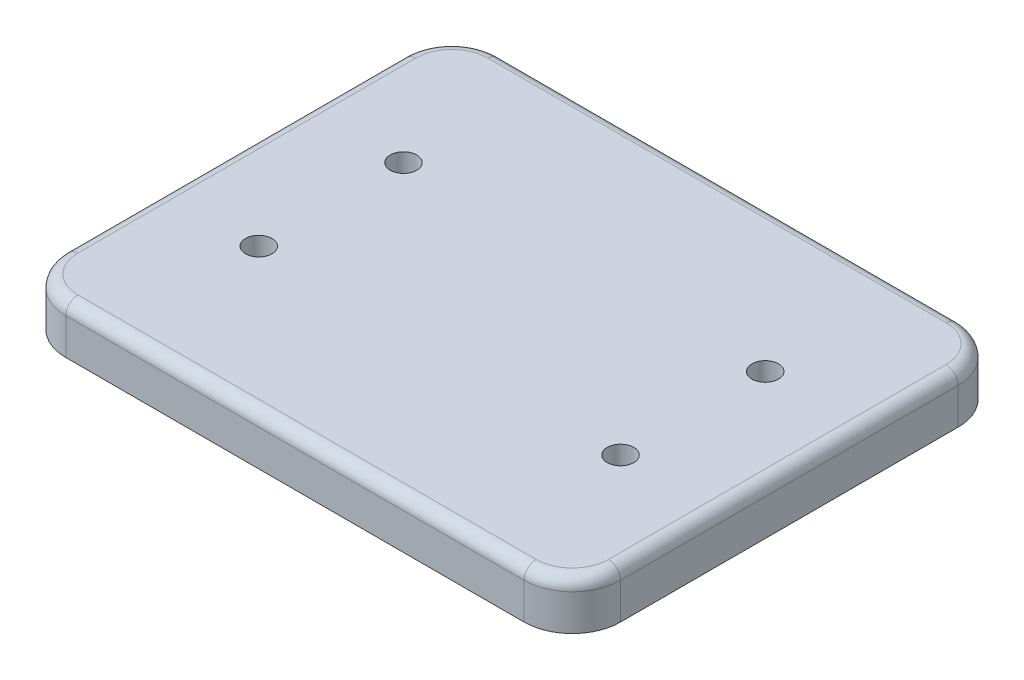
ISO-10303-21;
HEADER;
FILE_DESCRIPTION(('STEP AP214'),'2;1');
FILE_NAME('part.step','',(''),(''),'','','');
FILE_SCHEMA(('AUTOMOTIVE_DESIGN { 1 0 10303 214 1 1 1 1 }'));
ENDSEC;
DATA;
#1=APPLICATION_CONTEXT('core data for automotive mechanical design processes');
#2=APPLICATION_PROTOCOL_DEFINITION('international standard','automotive_design',2000,#1);
#3=PRODUCT_CONTEXT('',#1,'mechanical');
#4=PRODUCT('Part','Part','',(#3));
#5=PRODUCT_RELATED_PRODUCT_CATEGORY('part','',(#4));
#6=PRODUCT_DEFINITION_FORMATION('','',#4);
#7=PRODUCT_DEFINITION_CONTEXT('part definition',#1,'design');
#8=PRODUCT_DEFINITION('design','',#6,#7);
#9=PRODUCT_DEFINITION_SHAPE('','',#8);
#10=(LENGTH_UNIT() NAMED_UNIT(*) SI_UNIT(.MILLI.,.METRE.));
#11=(NAMED_UNIT(*) PLANE_ANGLE_UNIT() SI_UNIT($,.RADIAN.));
#12=(NAMED_UNIT(*) SI_UNIT($,.STERADIAN.) SOLID_ANGLE_UNIT());
#13=UNCERTAINTY_MEASURE_WITH_UNIT(LENGTH_MEASURE(1.E-05),#10,'distance_accuracy_value','');
#14=(GEOMETRIC_REPRESENTATION_CONTEXT(3) GLOBAL_UNCERTAINTY_ASSIGNED_CONTEXT((#13)) GLOBAL_UNIT_ASSIGNED_CONTEXT((#10,
#11,#12)) REPRESENTATION_CONTEXT('',''));
#15=CARTESIAN_POINT('',(0.,0.,0.));
#16=DIRECTION('',(0.,0.,1.));
#17=DIRECTION('',(1.,0.,0.));
#18=AXIS2_PLACEMENT_3D('',#15,#16,#17);
#19=CARTESIAN_POINT('',(-75.,-20.,30.));
#20=DIRECTION('',(0.,1.,0.));
#21=DIRECTION('',(0.,0.,1.));
#22=AXIS2_PLACEMENT_3D('',#19,#20,#21);
#23=CYLINDRICAL_SURFACE('',#22,5.49999999999999);
#24=CARTESIAN_POINT('',(-75.,0.,30.));
#25=DIRECTION('',(0.,-1.,0.));
#26=DIRECTION('',(0.,0.,-1.));
#27=AXIS2_PLACEMENT_3D('',#24,#25,#26);
#28=CIRCLE('',#27,5.49999999999999);
#29=CARTESIAN_POINT('',(-75.,0.,24.5));
#30=VERTEX_POINT('',#29);
#31=EDGE_CURVE('E258',#30,#30,#28,.T.);
#32=ORIENTED_EDGE('',*,*,#31,.F.);
#33=EDGE_LOOP('',(#32));
#34=FACE_BOUND('',#33,.T.);
#35=CARTESIAN_POINT('',(-75.,-9.,30.));
#36=DIRECTION('',(0.,-1.,0.));
#37=DIRECTION('',(0.,0.,-1.));
#38=AXIS2_PLACEMENT_3D('',#35,#36,#37);
#39=CIRCLE('',#38,5.49999999999999);
#40=CARTESIAN_POINT('',(-75.,-9.,24.5));
#41=VERTEX_POINT('',#40);
#42=EDGE_CURVE('E40',#41,#41,#39,.T.);
#43=ORIENTED_EDGE('',*,*,#42,.T.);
#44=EDGE_LOOP('',(#43));
#45=FACE_BOUND('',#44,.T.);
#46=ADVANCED_FACE('F36',(#34,#45),#23,.F.);
#47=CARTESIAN_POINT('',(75.,-20.,30.));
#48=DIRECTION('',(0.,1.,0.));
#49=DIRECTION('',(0.,0.,1.));
#50=AXIS2_PLACEMENT_3D('',#47,#48,#49);
#51=CYLINDRICAL_SURFACE('',#50,5.49999999999999);
#52=CARTESIAN_POINT('',(75.,0.,30.));
#53=DIRECTION('',(0.,1.,0.));
#54=DIRECTION('',(0.,0.,-1.));
#55=AXIS2_PLACEMENT_3D('',#52,#53,#54);
#56=CIRCLE('',#55,5.49999999999999);
#57=CARTESIAN_POINT('',(75.,0.,24.5));
#58=VERTEX_POINT('',#57);
#59=EDGE_CURVE('E245',#58,#58,#56,.T.);
#60=ORIENTED_EDGE('',*,*,#59,.T.);
#61=EDGE_LOOP('',(#60));
#62=FACE_BOUND('',#61,.T.);
#63=CARTESIAN_POINT('',(75.,-9.,30.));
#64=DIRECTION('',(0.,-1.,0.));
#65=DIRECTION('',(0.,0.,-1.));
#66=AXIS2_PLACEMENT_3D('',#63,#64,#65);
#67=CIRCLE('',#66,5.49999999999999);
#68=CARTESIAN_POINT('',(75.,-9.,24.5));
#69=VERTEX_POINT('',#68);
#70=EDGE_CURVE('E243',#69,#69,#67,.F.);
#71=ORIENTED_EDGE('',*,*,#70,.F.);
#72=EDGE_LOOP('',(#71));
#73=FACE_BOUND('',#72,.T.);
#74=ADVANCED_FACE('F292',(#62,#73),#51,.F.);
#75=CARTESIAN_POINT('',(75.,-20.,-30.));
#76=DIRECTION('',(0.,1.,0.));
#77=DIRECTION('',(0.,0.,1.));
#78=AXIS2_PLACEMENT_3D('',#75,#76,#77);
#79=CYLINDRICAL_SURFACE('',#78,5.49999999999999);
#80=CARTESIAN_POINT('',(75.,0.,-30.));
#81=DIRECTION('',(0.,-1.,0.));
#82=DIRECTION('',(0.,0.,1.));
#83=AXIS2_PLACEMENT_3D('',#80,#81,#82);
#84=CIRCLE('',#83,5.49999999999999);
#85=CARTESIAN_POINT('',(75.,0.,-24.5));
#86=VERTEX_POINT('',#85);
#87=EDGE_CURVE('E241',#86,#86,#84,.T.);
#88=ORIENTED_EDGE('',*,*,#87,.F.);
#89=EDGE_LOOP('',(#88));
#90=FACE_BOUND('',#89,.T.);
#91=CARTESIAN_POINT('',(75.,-9.,-30.));
#92=DIRECTION('',(0.,-1.,0.));
#93=DIRECTION('',(0.,0.,-1.));
#94=AXIS2_PLACEMENT_3D('',#91,#92,#93);
#95=CIRCLE('',#94,5.49999999999999);
#96=CARTESIAN_POINT('',(75.,-9.,-35.5));
#97=VERTEX_POINT('',#96);
#98=EDGE_CURVE('E239',#97,#97,#95,.T.);
#99=ORIENTED_EDGE('',*,*,#98,.T.);
#100=EDGE_LOOP('',(#99));
#101=FACE_BOUND('',#100,.T.);
#102=ADVANCED_FACE('F298',(#90,#101),#79,.F.);
#103=CARTESIAN_POINT('',(-75.,-20.,-30.));
#104=DIRECTION('',(0.,1.,0.));
#105=DIRECTION('',(0.,0.,1.));
#106=AXIS2_PLACEMENT_3D('',#103,#104,#105);
#107=CYLINDRICAL_SURFACE('',#106,5.49999999999999);
#108=CARTESIAN_POINT('',(-75.,0.,-30.));
#109=DIRECTION('',(0.,1.,0.));
#110=DIRECTION('',(0.,0.,1.));
#111=AXIS2_PLACEMENT_3D('',#108,#109,#110);
#112=CIRCLE('',#111,5.49999999999999);
#113=CARTESIAN_POINT('',(-75.,0.,-24.5));
#114=VERTEX_POINT('',#113);
#115=EDGE_CURVE('E154',#114,#114,#112,.T.);
#116=ORIENTED_EDGE('',*,*,#115,.T.);
#117=EDGE_LOOP('',(#116));
#118=FACE_BOUND('',#117,.T.);
#119=CARTESIAN_POINT('',(-75.,-9.,-30.));
#120=DIRECTION('',(0.,-1.,0.));
#121=DIRECTION('',(0.,0.,-1.));
#122=AXIS2_PLACEMENT_3D('',#119,#120,#121);
#123=CIRCLE('',#122,5.49999999999999);
#124=CARTESIAN_POINT('',(-75.,-9.,-35.5));
#125=VERTEX_POINT('',#124);
#126=EDGE_CURVE('E235',#125,#125,#123,.F.);
#127=ORIENTED_EDGE('',*,*,#126,.F.);
#128=EDGE_LOOP('',(#127));
#129=FACE_BOUND('',#128,.T.);
#130=ADVANCED_FACE('F324',(#118,#129),#107,.F.);
#131=CARTESIAN_POINT('',(-95.,-20.,-70.));
#132=DIRECTION('',(0.,1.,0.));
#133=DIRECTION('',(0.,0.,1.));
#134=AXIS2_PLACEMENT_3D('',#131,#132,#133);
#135=CYLINDRICAL_SURFACE('',#134,20.);
#136=DIRECTION('',(0.,1.,0.));
#137=VECTOR('',#136,1.);
#138=CARTESIAN_POINT('',(-115.,-20.,-69.9999999999998));
#139=LINE('',#138,#137);
#140=CARTESIAN_POINT('',(-115.,-20.,-69.9999999999998));
#141=VERTEX_POINT('',#140);
#142=CARTESIAN_POINT('',(-115.,-5.,-69.9999999999998));
#143=VERTEX_POINT('',#142);
#144=EDGE_CURVE('E124',#141,#143,#139,.T.);
#145=ORIENTED_EDGE('',*,*,#144,.T.);
#146=CARTESIAN_POINT('',(-95.,-5.,-70.));
#147=DIRECTION('',(0.,1.,0.));
#148=DIRECTION('',(0.,0.,1.));
#149=AXIS2_PLACEMENT_3D('',#146,#147,#148);
#150=CIRCLE('',#149,20.);
#151=CARTESIAN_POINT('',(-94.9999999999998,-5.,-90.));
#152=VERTEX_POINT('',#151);
#153=EDGE_CURVE('E11',#143,#152,#150,.F.);
#154=ORIENTED_EDGE('',*,*,#153,.T.);
#155=DIRECTION('',(0.,1.,0.));
#156=VECTOR('',#155,1.);
#157=CARTESIAN_POINT('',(-94.9999999999998,-20.,-90.));
#158=LINE('',#157,#156);
#159=CARTESIAN_POINT('',(-94.9999999999998,-20.,-90.));
#160=VERTEX_POINT('',#159);
#161=EDGE_CURVE('E147',#160,#152,#158,.T.);
#162=ORIENTED_EDGE('',*,*,#161,.F.);
#163=CARTESIAN_POINT('',(-95.,-20.,-70.));
#164=DIRECTION('',(0.,1.,0.));
#165=DIRECTION('',(0.,0.,1.));
#166=AXIS2_PLACEMENT_3D('',#163,#164,#165);
#167=CIRCLE('',#166,20.);
#168=EDGE_CURVE('E139',#160,#141,#167,.T.);
#169=ORIENTED_EDGE('',*,*,#168,.T.);
#170=EDGE_LOOP('',(#145,#154,#162,#169));
#171=FACE_BOUND('',#170,.T.);
#172=ADVANCED_FACE('F145',(#171),#135,.T.);
#173=CARTESIAN_POINT('',(-94.9999999999998,-20.,-90.));
#174=DIRECTION('',(0.,0.,-1.));
#175=DIRECTION('',(-1.,0.,0.));
#176=AXIS2_PLACEMENT_3D('',#173,#174,#175);
#177=PLANE('',#176);
#178=ORIENTED_EDGE('',*,*,#161,.T.);
#179=DIRECTION('',(-1.,0.,0.));
#180=VECTOR('',#179,1.);
#181=CARTESIAN_POINT('',(-94.9999999999998,-5.,-90.));
#182=LINE('',#181,#180);
#183=CARTESIAN_POINT('',(94.9999999999999,-5.,-90.));
#184=VERTEX_POINT('',#183);
#185=EDGE_CURVE('E204',#152,#184,#182,.F.);
#186=ORIENTED_EDGE('',*,*,#185,.T.);
#187=DIRECTION('',(0.,1.,0.));
#188=VECTOR('',#187,1.);
#189=CARTESIAN_POINT('',(94.9999999999999,-20.,-90.));
#190=LINE('',#189,#188);
#191=CARTESIAN_POINT('',(94.9999999999999,-20.,-90.));
#192=VERTEX_POINT('',#191);
#193=EDGE_CURVE('E173',#192,#184,#190,.T.);
#194=ORIENTED_EDGE('',*,*,#193,.F.);
#195=DIRECTION('',(-1.,0.,0.));
#196=VECTOR('',#195,1.);
#197=CARTESIAN_POINT('',(-94.9999999999998,-20.,-90.));
#198=LINE('',#197,#196);
#199=EDGE_CURVE('E132',#192,#160,#198,.T.);
#200=ORIENTED_EDGE('',*,*,#199,.T.);
#201=EDGE_LOOP('',(#178,#186,#194,#200));
#202=FACE_BOUND('',#201,.T.);
#203=ADVANCED_FACE('F338',(#202),#177,.T.);
#204=CARTESIAN_POINT('',(95.,-20.,-70.));
#205=DIRECTION('',(0.,1.,0.));
#206=DIRECTION('',(0.,0.,1.));
#207=AXIS2_PLACEMENT_3D('',#204,#205,#206);
#208=CYLINDRICAL_SURFACE('',#207,20.);
#209=ORIENTED_EDGE('',*,*,#193,.T.);
#210=CARTESIAN_POINT('',(95.,-5.,-70.));
#211=DIRECTION('',(0.,1.,0.));
#212=DIRECTION('',(0.,0.,1.));
#213=AXIS2_PLACEMENT_3D('',#210,#211,#212);
#214=CIRCLE('',#213,20.);
#215=CARTESIAN_POINT('',(115.,-5.,-69.9999999999998));
#216=VERTEX_POINT('',#215);
#217=EDGE_CURVE('E207',#184,#216,#214,.F.);
#218=ORIENTED_EDGE('',*,*,#217,.T.);
#219=DIRECTION('',(0.,1.,0.));
#220=VECTOR('',#219,1.);
#221=CARTESIAN_POINT('',(115.,-20.,-69.9999999999998));
#222=LINE('',#221,#220);
#223=CARTESIAN_POINT('',(115.,-20.,-69.9999999999998));
#224=VERTEX_POINT('',#223);
#225=EDGE_CURVE('E176',#224,#216,#222,.T.);
#226=ORIENTED_EDGE('',*,*,#225,.F.);
#227=CARTESIAN_POINT('',(95.,-20.,-70.));
#228=DIRECTION('',(0.,1.,0.));
#229=DIRECTION('',(0.,0.,1.));
#230=AXIS2_PLACEMENT_3D('',#227,#228,#229);
#231=CIRCLE('',#230,20.);
#232=EDGE_CURVE('E167',#224,#192,#231,.T.);
#233=ORIENTED_EDGE('',*,*,#232,.T.);
#234=EDGE_LOOP('',(#209,#218,#226,#233));
#235=FACE_BOUND('',#234,.T.);
#236=ADVANCED_FACE('F592',(#235),#208,.T.);
#237=CARTESIAN_POINT('',(115.,-20.,69.9999999999999));
#238=DIRECTION('',(1.,0.,0.));
#239=DIRECTION('',(0.,0.,-1.));
#240=AXIS2_PLACEMENT_3D('',#237,#238,#239);
#241=PLANE('',#240);
#242=ORIENTED_EDGE('',*,*,#225,.T.);
#243=DIRECTION('',(0.,0.,-1.));
#244=VECTOR('',#243,1.);
#245=CARTESIAN_POINT('',(115.,-5.,69.9999999999999));
#246=LINE('',#245,#244);
#247=CARTESIAN_POINT('',(115.,-5.,69.9999999999999));
#248=VERTEX_POINT('',#247);
#249=EDGE_CURVE('E209',#216,#248,#246,.F.);
#250=ORIENTED_EDGE('',*,*,#249,.T.);
#251=DIRECTION('',(0.,1.,0.));
#252=VECTOR('',#251,1.);
#253=CARTESIAN_POINT('',(115.,-20.,69.9999999999999));
#254=LINE('',#253,#252);
#255=CARTESIAN_POINT('',(115.,-20.,69.9999999999999));
#256=VERTEX_POINT('',#255);
#257=EDGE_CURVE('E179',#256,#248,#254,.T.);
#258=ORIENTED_EDGE('',*,*,#257,.F.);
#259=DIRECTION('',(0.,0.,-1.));
#260=VECTOR('',#259,1.);
#261=CARTESIAN_POINT('',(115.,-20.,69.9999999999999));
#262=LINE('',#261,#260);
#263=EDGE_CURVE('E164',#256,#224,#262,.T.);
#264=ORIENTED_EDGE('',*,*,#263,.T.);
#265=EDGE_LOOP('',(#242,#250,#258,#264));
#266=FACE_BOUND('',#265,.T.);
#267=ADVANCED_FACE('F383',(#266),#241,.T.);
#268=CARTESIAN_POINT('',(95.,-20.,70.));
#269=DIRECTION('',(0.,1.,0.));
#270=DIRECTION('',(0.,0.,1.));
#271=AXIS2_PLACEMENT_3D('',#268,#269,#270);
#272=CYLINDRICAL_SURFACE('',#271,20.);
#273=ORIENTED_EDGE('',*,*,#257,.T.);
#274=CARTESIAN_POINT('',(95.,-5.,70.));
#275=DIRECTION('',(0.,1.,0.));
#276=DIRECTION('',(0.,0.,1.));
#277=AXIS2_PLACEMENT_3D('',#274,#275,#276);
#278=CIRCLE('',#277,20.);
#279=CARTESIAN_POINT('',(94.9999999999999,-5.,90.));
#280=VERTEX_POINT('',#279);
#281=EDGE_CURVE('E211',#248,#280,#278,.F.);
#282=ORIENTED_EDGE('',*,*,#281,.T.);
#283=DIRECTION('',(0.,1.,0.));
#284=VECTOR('',#283,1.);
#285=CARTESIAN_POINT('',(94.9999999999999,-20.,90.));
#286=LINE('',#285,#284);
#287=CARTESIAN_POINT('',(94.9999999999999,-20.,90.));
#288=VERTEX_POINT('',#287);
#289=EDGE_CURVE('E182',#288,#280,#286,.T.);
#290=ORIENTED_EDGE('',*,*,#289,.F.);
#291=CARTESIAN_POINT('',(95.,-20.,70.));
#292=DIRECTION('',(0.,1.,0.));
#293=DIRECTION('',(0.,0.,-1.));
#294=AXIS2_PLACEMENT_3D('',#291,#292,#293);
#295=CIRCLE('',#294,20.);
#296=EDGE_CURVE('E161',#288,#256,#295,.T.);
#297=ORIENTED_EDGE('',*,*,#296,.T.);
#298=EDGE_LOOP('',(#273,#282,#290,#297));
#299=FACE_BOUND('',#298,.T.);
#300=ADVANCED_FACE('F386',(#299),#272,.T.);
#301=CARTESIAN_POINT('',(-94.9999999999998,-20.,90.));
#302=DIRECTION('',(0.,0.,1.));
#303=DIRECTION('',(1.,0.,0.));
#304=AXIS2_PLACEMENT_3D('',#301,#302,#303);
#305=PLANE('',#304);
#306=ORIENTED_EDGE('',*,*,#289,.T.);
#307=DIRECTION('',(1.,0.,0.));
#308=VECTOR('',#307,1.);
#309=CARTESIAN_POINT('',(-94.9999999999998,-5.,90.));
#310=LINE('',#309,#308);
#311=CARTESIAN_POINT('',(-94.9999999999998,-5.,90.));
#312=VERTEX_POINT('',#311);
#313=EDGE_CURVE('E213',#280,#312,#310,.F.);
#314=ORIENTED_EDGE('',*,*,#313,.T.);
#315=DIRECTION('',(0.,1.,0.));
#316=VECTOR('',#315,1.);
#317=CARTESIAN_POINT('',(-94.9999999999998,-20.,90.));
#318=LINE('',#317,#316);
#319=CARTESIAN_POINT('',(-94.9999999999998,-20.,90.));
#320=VERTEX_POINT('',#319);
#321=EDGE_CURVE('E185',#320,#312,#318,.T.);
#322=ORIENTED_EDGE('',*,*,#321,.F.);
#323=DIRECTION('',(1.,0.,0.));
#324=VECTOR('',#323,1.);
#325=CARTESIAN_POINT('',(-94.9999999999998,-20.,90.));
#326=LINE('',#325,#324);
#327=EDGE_CURVE('E158',#320,#288,#326,.T.);
#328=ORIENTED_EDGE('',*,*,#327,.T.);
#329=EDGE_LOOP('',(#306,#314,#322,#328));
#330=FACE_BOUND('',#329,.T.);
#331=ADVANCED_FACE('F390',(#330),#305,.T.);
#332=CARTESIAN_POINT('',(-95.,-20.,70.));
#333=DIRECTION('',(0.,1.,0.));
#334=DIRECTION('',(0.,0.,1.));
#335=AXIS2_PLACEMENT_3D('',#332,#333,#334);
#336=CYLINDRICAL_SURFACE('',#335,20.);
#337=ORIENTED_EDGE('',*,*,#321,.T.);
#338=CARTESIAN_POINT('',(-95.,-5.,70.));
#339=DIRECTION('',(0.,1.,0.));
#340=DIRECTION('',(0.,0.,1.));
#341=AXIS2_PLACEMENT_3D('',#338,#339,#340);
#342=CIRCLE('',#341,20.);
#343=CARTESIAN_POINT('',(-115.,-5.,69.9999999999999));
#344=VERTEX_POINT('',#343);
#345=EDGE_CURVE('E60',#312,#344,#342,.F.);
#346=ORIENTED_EDGE('',*,*,#345,.T.);
#347=DIRECTION('',(0.,1.,0.));
#348=VECTOR('',#347,1.);
#349=CARTESIAN_POINT('',(-115.,-20.,69.9999999999999));
#350=LINE('',#349,#348);
#351=CARTESIAN_POINT('',(-115.,-20.,69.9999999999999));
#352=VERTEX_POINT('',#351);
#353=EDGE_CURVE('E131',#352,#344,#350,.T.);
#354=ORIENTED_EDGE('',*,*,#353,.F.);
#355=CARTESIAN_POINT('',(-95.,-20.,70.));
#356=DIRECTION('',(0.,1.,0.));
#357=DIRECTION('',(0.,0.,-1.));
#358=AXIS2_PLACEMENT_3D('',#355,#356,#357);
#359=CIRCLE('',#358,20.);
#360=EDGE_CURVE('E143',#352,#320,#359,.T.);
#361=ORIENTED_EDGE('',*,*,#360,.T.);
#362=EDGE_LOOP('',(#337,#346,#354,#361));
#363=FACE_BOUND('',#362,.T.);
#364=ADVANCED_FACE('F286',(#363),#336,.T.);
#365=CARTESIAN_POINT('',(-115.,-20.,69.9999999999999));
#366=DIRECTION('',(-1.,0.,0.));
#367=DIRECTION('',(0.,0.,1.));
#368=AXIS2_PLACEMENT_3D('',#365,#366,#367);
#369=PLANE('',#368);
#370=ORIENTED_EDGE('',*,*,#353,.T.);
#371=DIRECTION('',(0.,0.,1.));
#372=VECTOR('',#371,1.);
#373=CARTESIAN_POINT('',(-115.,-5.,69.9999999999999));
#374=LINE('',#373,#372);
#375=EDGE_CURVE('E45',#344,#143,#374,.F.);
#376=ORIENTED_EDGE('',*,*,#375,.T.);
#377=ORIENTED_EDGE('',*,*,#144,.F.);
#378=DIRECTION('',(0.,0.,1.));
#379=VECTOR('',#378,1.);
#380=CARTESIAN_POINT('',(-115.,-20.,69.9999999999999));
#381=LINE('',#380,#379);
#382=EDGE_CURVE('E127',#141,#352,#381,.T.);
#383=ORIENTED_EDGE('',*,*,#382,.T.);
#384=EDGE_LOOP('',(#370,#376,#377,#383));
#385=FACE_BOUND('',#384,.T.);
#386=ADVANCED_FACE('F126',(#385),#369,.T.);
#387=CARTESIAN_POINT('',(-95.,-20.,-70.));
#388=DIRECTION('',(0.,1.,0.));
#389=DIRECTION('',(0.,0.,1.));
#390=AXIS2_PLACEMENT_3D('',#387,#388,#389);
#391=PLANE('',#390);
#392=CARTESIAN_POINT('',(-75.,-20.,30.));
#393=DIRECTION('',(0.,1.,0.));
#394=DIRECTION('',(0.,0.,1.));
#395=AXIS2_PLACEMENT_3D('',#392,#393,#394);
#396=CIRCLE('',#395,9.);
#397=CARTESIAN_POINT('',(-75.,-20.,39.));
#398=VERTEX_POINT('',#397);
#399=EDGE_CURVE('E465',#398,#398,#396,.T.);
#400=ORIENTED_EDGE('',*,*,#399,.T.);
#401=EDGE_LOOP('',(#400));
#402=FACE_BOUND('',#401,.T.);
#403=CARTESIAN_POINT('',(75.,-20.,30.));
#404=DIRECTION('',(0.,-1.,0.));
#405=DIRECTION('',(0.,0.,1.));
#406=AXIS2_PLACEMENT_3D('',#403,#404,#405);
#407=CIRCLE('',#406,9.);
#408=CARTESIAN_POINT('',(75.,-20.,39.));
#409=VERTEX_POINT('',#408);
#410=EDGE_CURVE('E253',#409,#409,#407,.T.);
#411=ORIENTED_EDGE('',*,*,#410,.F.);
#412=EDGE_LOOP('',(#411));
#413=FACE_BOUND('',#412,.T.);
#414=CARTESIAN_POINT('',(75.,-20.,-30.));
#415=DIRECTION('',(0.,1.,0.));
#416=DIRECTION('',(0.,0.,-1.));
#417=AXIS2_PLACEMENT_3D('',#414,#415,#416);
#418=CIRCLE('',#417,9.);
#419=CARTESIAN_POINT('',(75.,-20.,-39.));
#420=VERTEX_POINT('',#419);
#421=EDGE_CURVE('E250',#420,#420,#418,.T.);
#422=ORIENTED_EDGE('',*,*,#421,.T.);
#423=EDGE_LOOP('',(#422));
#424=FACE_BOUND('',#423,.T.);
#425=CARTESIAN_POINT('',(-75.,-20.,-30.));
#426=DIRECTION('',(0.,-1.,0.));
#427=DIRECTION('',(0.,0.,-1.));
#428=AXIS2_PLACEMENT_3D('',#425,#426,#427);
#429=CIRCLE('',#428,9.);
#430=CARTESIAN_POINT('',(-75.,-20.,-39.));
#431=VERTEX_POINT('',#430);
#432=EDGE_CURVE('E269',#431,#431,#429,.T.);
#433=ORIENTED_EDGE('',*,*,#432,.F.);
#434=EDGE_LOOP('',(#433));
#435=FACE_BOUND('',#434,.T.);
#436=ORIENTED_EDGE('',*,*,#168,.F.);
#437=ORIENTED_EDGE('',*,*,#199,.F.);
#438=ORIENTED_EDGE('',*,*,#232,.F.);
#439=ORIENTED_EDGE('',*,*,#263,.F.);
#440=ORIENTED_EDGE('',*,*,#296,.F.);
#441=ORIENTED_EDGE('',*,*,#327,.F.);
#442=ORIENTED_EDGE('',*,*,#360,.F.);
#443=ORIENTED_EDGE('',*,*,#382,.F.);
#444=EDGE_LOOP('',(#436,#437,#438,#439,#440,#441,#442,#443));
#445=FACE_BOUND('',#444,.T.);
#446=ADVANCED_FACE('F137',(#402,#413,#424,#435,#445),#391,.F.);
#447=CARTESIAN_POINT('',(-95.,0.,-70.));
#448=DIRECTION('',(0.,1.,0.));
#449=DIRECTION('',(0.,0.,1.));
#450=AXIS2_PLACEMENT_3D('',#447,#448,#449);
#451=PLANE('',#450);
#452=ORIENTED_EDGE('',*,*,#31,.T.);
#453=EDGE_LOOP('',(#452));
#454=FACE_BOUND('',#453,.T.);
#455=ORIENTED_EDGE('',*,*,#59,.F.);
#456=EDGE_LOOP('',(#455));
#457=FACE_BOUND('',#456,.T.);
#458=ORIENTED_EDGE('',*,*,#87,.T.);
#459=EDGE_LOOP('',(#458));
#460=FACE_BOUND('',#459,.T.);
#461=ORIENTED_EDGE('',*,*,#115,.F.);
#462=EDGE_LOOP('',(#461));
#463=FACE_BOUND('',#462,.T.);
#464=CARTESIAN_POINT('',(95.,0.,-70.));
#465=DIRECTION('',(0.,1.,0.));
#466=DIRECTION('',(0.,0.,1.));
#467=AXIS2_PLACEMENT_3D('',#464,#465,#466);
#468=CIRCLE('',#467,15.);
#469=CARTESIAN_POINT('',(110.,0.,-69.9999999999999));
#470=VERTEX_POINT('',#469);
#471=CARTESIAN_POINT('',(94.9999999999999,0.,-85.));
#472=VERTEX_POINT('',#471);
#473=EDGE_CURVE('E199',#470,#472,#468,.T.);
#474=ORIENTED_EDGE('',*,*,#473,.T.);
#475=DIRECTION('',(-1.,0.,0.));
#476=VECTOR('',#475,1.);
#477=CARTESIAN_POINT('',(-95.,0.,-85.));
#478=LINE('',#477,#476);
#479=CARTESIAN_POINT('',(-94.9999999999998,0.,-85.));
#480=VERTEX_POINT('',#479);
#481=EDGE_CURVE('E201',#472,#480,#478,.T.);
#482=ORIENTED_EDGE('',*,*,#481,.T.);
#483=CARTESIAN_POINT('',(-95.,0.,-70.));
#484=DIRECTION('',(0.,1.,0.));
#485=DIRECTION('',(0.,0.,1.));
#486=AXIS2_PLACEMENT_3D('',#483,#484,#485);
#487=CIRCLE('',#486,15.);
#488=CARTESIAN_POINT('',(-110.,0.,-69.9999999999998));
#489=VERTEX_POINT('',#488);
#490=EDGE_CURVE('E172',#480,#489,#487,.T.);
#491=ORIENTED_EDGE('',*,*,#490,.T.);
#492=DIRECTION('',(0.,0.,1.));
#493=VECTOR('',#492,1.);
#494=CARTESIAN_POINT('',(-110.,0.,-70.));
#495=LINE('',#494,#493);
#496=CARTESIAN_POINT('',(-110.,0.,69.9999999999999));
#497=VERTEX_POINT('',#496);
#498=EDGE_CURVE('E189',#489,#497,#495,.T.);
#499=ORIENTED_EDGE('',*,*,#498,.T.);
#500=CARTESIAN_POINT('',(-95.,0.,70.));
#501=DIRECTION('',(0.,1.,0.));
#502=DIRECTION('',(0.,0.,1.));
#503=AXIS2_PLACEMENT_3D('',#500,#501,#502);
#504=CIRCLE('',#503,15.);
#505=CARTESIAN_POINT('',(-94.9999999999998,0.,85.));
#506=VERTEX_POINT('',#505);
#507=EDGE_CURVE('E191',#497,#506,#504,.T.);
#508=ORIENTED_EDGE('',*,*,#507,.T.);
#509=DIRECTION('',(1.,0.,0.));
#510=VECTOR('',#509,1.);
#511=CARTESIAN_POINT('',(-95.,0.,85.));
#512=LINE('',#511,#510);
#513=CARTESIAN_POINT('',(94.9999999999999,0.,85.));
#514=VERTEX_POINT('',#513);
#515=EDGE_CURVE('E193',#506,#514,#512,.T.);
#516=ORIENTED_EDGE('',*,*,#515,.T.);
#517=CARTESIAN_POINT('',(95.,0.,70.));
#518=DIRECTION('',(0.,1.,0.));
#519=DIRECTION('',(0.,0.,1.));
#520=AXIS2_PLACEMENT_3D('',#517,#518,#519);
#521=CIRCLE('',#520,15.);
#522=CARTESIAN_POINT('',(110.,0.,69.9999999999999));
#523=VERTEX_POINT('',#522);
#524=EDGE_CURVE('E195',#514,#523,#521,.T.);
#525=ORIENTED_EDGE('',*,*,#524,.T.);
#526=DIRECTION('',(0.,0.,-1.));
#527=VECTOR('',#526,1.);
#528=CARTESIAN_POINT('',(110.,0.,-70.));
#529=LINE('',#528,#527);
#530=EDGE_CURVE('E197',#523,#470,#529,.T.);
#531=ORIENTED_EDGE('',*,*,#530,.T.);
#532=EDGE_LOOP('',(#474,#482,#491,#499,#508,#516,#525,#531));
#533=FACE_BOUND('',#532,.T.);
#534=ADVANCED_FACE('F277',(#454,#457,#460,#463,#533),#451,.T.);
#535=CARTESIAN_POINT('',(-95.,-5.,85.));
#536=DIRECTION('',(1.,0.,0.));
#537=DIRECTION('',(0.,0.,-1.));
#538=AXIS2_PLACEMENT_3D('',#535,#536,#537);
#539=CYLINDRICAL_SURFACE('',#538,5.);
#540=CARTESIAN_POINT('',(-94.9999999999998,-5.,85.));
#541=DIRECTION('',(-1.,0.,0.));
#542=DIRECTION('',(0.,0.,1.));
#543=AXIS2_PLACEMENT_3D('',#540,#541,#542);
#544=CIRCLE('',#543,5.);
#545=EDGE_CURVE('E151',#312,#506,#544,.T.);
#546=ORIENTED_EDGE('',*,*,#545,.F.);
#547=ORIENTED_EDGE('',*,*,#313,.F.);
#548=CARTESIAN_POINT('',(94.9999999999999,-5.,85.));
#549=DIRECTION('',(1.,0.,0.));
#550=DIRECTION('',(0.,0.,-1.));
#551=AXIS2_PLACEMENT_3D('',#548,#549,#550);
#552=CIRCLE('',#551,5.);
#553=EDGE_CURVE('E148',#514,#280,#552,.T.);
#554=ORIENTED_EDGE('',*,*,#553,.F.);
#555=ORIENTED_EDGE('',*,*,#515,.F.);
#556=EDGE_LOOP('',(#546,#547,#554,#555));
#557=FACE_BOUND('',#556,.T.);
#558=ADVANCED_FACE('F38',(#557),#539,.T.);
#559=CARTESIAN_POINT('',(95.,-5.,70.));
#560=DIRECTION('',(0.,1.,0.));
#561=DIRECTION('',(0.,0.,1.));
#562=AXIS2_PLACEMENT_3D('',#559,#560,#561);
#563=TOROIDAL_SURFACE('',#562,15.,5.);
#564=ORIENTED_EDGE('',*,*,#553,.T.);
#565=ORIENTED_EDGE('',*,*,#281,.F.);
#566=CARTESIAN_POINT('',(110.,-5.,69.9999999999999));
#567=DIRECTION('',(0.,0.,-1.));
#568=DIRECTION('',(-1.,0.,0.));
#569=AXIS2_PLACEMENT_3D('',#566,#567,#568);
#570=CIRCLE('',#569,5.);
#571=EDGE_CURVE('E230',#523,#248,#570,.T.);
#572=ORIENTED_EDGE('',*,*,#571,.F.);
#573=ORIENTED_EDGE('',*,*,#524,.F.);
#574=EDGE_LOOP('',(#564,#565,#572,#573));
#575=FACE_BOUND('',#574,.T.);
#576=ADVANCED_FACE('F378',(#575),#563,.T.);
#577=CARTESIAN_POINT('',(-95.,-5.,70.));
#578=DIRECTION('',(0.,1.,0.));
#579=DIRECTION('',(0.,0.,1.));
#580=AXIS2_PLACEMENT_3D('',#577,#578,#579);
#581=TOROIDAL_SURFACE('',#580,15.,5.);
#582=ORIENTED_EDGE('',*,*,#545,.T.);
#583=ORIENTED_EDGE('',*,*,#507,.F.);
#584=CARTESIAN_POINT('',(-110.,-5.,69.9999999999999));
#585=DIRECTION('',(0.,0.,-1.));
#586=DIRECTION('',(-1.,0.,0.));
#587=AXIS2_PLACEMENT_3D('',#584,#585,#586);
#588=CIRCLE('',#587,5.);
#589=EDGE_CURVE('E227',#344,#497,#588,.T.);
#590=ORIENTED_EDGE('',*,*,#589,.F.);
#591=ORIENTED_EDGE('',*,*,#345,.F.);
#592=EDGE_LOOP('',(#582,#583,#590,#591));
#593=FACE_BOUND('',#592,.T.);
#594=ADVANCED_FACE('F368',(#593),#581,.T.);
#595=CARTESIAN_POINT('',(110.,-5.,-70.));
#596=DIRECTION('',(0.,0.,-1.));
#597=DIRECTION('',(-1.,0.,0.));
#598=AXIS2_PLACEMENT_3D('',#595,#596,#597);
#599=CYLINDRICAL_SURFACE('',#598,5.);
#600=ORIENTED_EDGE('',*,*,#571,.T.);
#601=ORIENTED_EDGE('',*,*,#249,.F.);
#602=CARTESIAN_POINT('',(110.,-5.,-69.9999999999999));
#603=DIRECTION('',(0.,0.,-1.));
#604=DIRECTION('',(-1.,0.,0.));
#605=AXIS2_PLACEMENT_3D('',#602,#603,#604);
#606=CIRCLE('',#605,5.);
#607=EDGE_CURVE('E224',#470,#216,#606,.T.);
#608=ORIENTED_EDGE('',*,*,#607,.F.);
#609=ORIENTED_EDGE('',*,*,#530,.F.);
#610=EDGE_LOOP('',(#600,#601,#608,#609));
#611=FACE_BOUND('',#610,.T.);
#612=ADVANCED_FACE('F381',(#611),#599,.T.);
#613=CARTESIAN_POINT('',(-110.,-5.,-70.));
#614=DIRECTION('',(0.,0.,1.));
#615=DIRECTION('',(1.,0.,0.));
#616=AXIS2_PLACEMENT_3D('',#613,#614,#615);
#617=CYLINDRICAL_SURFACE('',#616,5.);
#618=ORIENTED_EDGE('',*,*,#589,.T.);
#619=ORIENTED_EDGE('',*,*,#498,.F.);
#620=CARTESIAN_POINT('',(-110.,-5.,-69.9999999999998));
#621=DIRECTION('',(0.,0.,-1.));
#622=DIRECTION('',(-1.,0.,0.));
#623=AXIS2_PLACEMENT_3D('',#620,#621,#622);
#624=CIRCLE('',#623,5.);
#625=EDGE_CURVE('E221',#143,#489,#624,.T.);
#626=ORIENTED_EDGE('',*,*,#625,.F.);
#627=ORIENTED_EDGE('',*,*,#375,.F.);
#628=EDGE_LOOP('',(#618,#619,#626,#627));
#629=FACE_BOUND('',#628,.T.);
#630=ADVANCED_FACE('F365',(#629),#617,.T.);
#631=CARTESIAN_POINT('',(95.,-5.,-70.));
#632=DIRECTION('',(0.,1.,0.));
#633=DIRECTION('',(0.,0.,1.));
#634=AXIS2_PLACEMENT_3D('',#631,#632,#633);
#635=TOROIDAL_SURFACE('',#634,15.,5.);
#636=ORIENTED_EDGE('',*,*,#607,.T.);
#637=ORIENTED_EDGE('',*,*,#217,.F.);
#638=CARTESIAN_POINT('',(94.9999999999999,-5.,-85.));
#639=DIRECTION('',(-1.,0.,0.));
#640=DIRECTION('',(0.,0.,1.));
#641=AXIS2_PLACEMENT_3D('',#638,#639,#640);
#642=CIRCLE('',#641,5.);
#643=EDGE_CURVE('E219',#472,#184,#642,.T.);
#644=ORIENTED_EDGE('',*,*,#643,.F.);
#645=ORIENTED_EDGE('',*,*,#473,.F.);
#646=EDGE_LOOP('',(#636,#637,#644,#645));
#647=FACE_BOUND('',#646,.T.);
#648=ADVANCED_FACE('F354',(#647),#635,.T.);
#649=CARTESIAN_POINT('',(-95.,-5.,-70.));
#650=DIRECTION('',(0.,1.,0.));
#651=DIRECTION('',(0.,0.,1.));
#652=AXIS2_PLACEMENT_3D('',#649,#650,#651);
#653=TOROIDAL_SURFACE('',#652,15.,5.);
#654=ORIENTED_EDGE('',*,*,#625,.T.);
#655=ORIENTED_EDGE('',*,*,#490,.F.);
#656=CARTESIAN_POINT('',(-94.9999999999999,-5.,-85.));
#657=DIRECTION('',(1.,0.,0.));
#658=DIRECTION('',(0.,0.,-1.));
#659=AXIS2_PLACEMENT_3D('',#656,#657,#658);
#660=CIRCLE('',#659,5.);
#661=EDGE_CURVE('E217',#152,#480,#660,.T.);
#662=ORIENTED_EDGE('',*,*,#661,.F.);
#663=ORIENTED_EDGE('',*,*,#153,.F.);
#664=EDGE_LOOP('',(#654,#655,#662,#663));
#665=FACE_BOUND('',#664,.T.);
#666=ADVANCED_FACE('F361',(#665),#653,.T.);
#667=CARTESIAN_POINT('',(-95.,-5.,-85.));
#668=DIRECTION('',(-1.,0.,0.));
#669=DIRECTION('',(0.,0.,1.));
#670=AXIS2_PLACEMENT_3D('',#667,#668,#669);
#671=CYLINDRICAL_SURFACE('',#670,5.);
#672=ORIENTED_EDGE('',*,*,#643,.T.);
#673=ORIENTED_EDGE('',*,*,#185,.F.);
#674=ORIENTED_EDGE('',*,*,#661,.T.);
#675=ORIENTED_EDGE('',*,*,#481,.F.);
#676=EDGE_LOOP('',(#672,#673,#674,#675));
#677=FACE_BOUND('',#676,.T.);
#678=ADVANCED_FACE('F329',(#677),#671,.T.);
#679=CARTESIAN_POINT('',(-75.,-9.,-30.));
#680=DIRECTION('',(0.,-1.,0.));
#681=DIRECTION('',(0.,0.,-1.));
#682=AXIS2_PLACEMENT_3D('',#679,#680,#681);
#683=PLANE('',#682);
#684=CARTESIAN_POINT('',(-75.,-9.,-30.));
#685=DIRECTION('',(0.,-1.,0.));
#686=DIRECTION('',(0.,0.,-1.));
#687=AXIS2_PLACEMENT_3D('',#684,#685,#686);
#688=CIRCLE('',#687,9.);
#689=CARTESIAN_POINT('',(-75.,-9.,-39.));
#690=VERTEX_POINT('',#689);
#691=EDGE_CURVE('E238',#690,#690,#688,.T.);
#692=ORIENTED_EDGE('',*,*,#691,.T.);
#693=EDGE_LOOP('',(#692));
#694=FACE_BOUND('',#693,.T.);
#695=ORIENTED_EDGE('',*,*,#126,.T.);
#696=EDGE_LOOP('',(#695));
#697=FACE_BOUND('',#696,.T.);
#698=ADVANCED_FACE('F326',(#694,#697),#683,.T.);
#699=CARTESIAN_POINT('',(-75.,-9.,-30.));
#700=DIRECTION('',(0.,-1.,0.));
#701=DIRECTION('',(0.,0.,-1.));
#702=AXIS2_PLACEMENT_3D('',#699,#700,#701);
#703=CYLINDRICAL_SURFACE('',#702,9.);
#704=ORIENTED_EDGE('',*,*,#691,.F.);
#705=EDGE_LOOP('',(#704));
#706=FACE_BOUND('',#705,.T.);
#707=ORIENTED_EDGE('',*,*,#432,.T.);
#708=EDGE_LOOP('',(#707));
#709=FACE_BOUND('',#708,.T.);
#710=ADVANCED_FACE('F274',(#706,#709),#703,.F.);
#711=CARTESIAN_POINT('',(75.,-9.,-30.));
#712=DIRECTION('',(0.,-1.,0.));
#713=DIRECTION('',(0.,0.,-1.));
#714=AXIS2_PLACEMENT_3D('',#711,#712,#713);
#715=CYLINDRICAL_SURFACE('',#714,9.);
#716=CARTESIAN_POINT('',(75.,-9.,-30.));
#717=DIRECTION('',(0.,1.,0.));
#718=DIRECTION('',(0.,0.,-1.));
#719=AXIS2_PLACEMENT_3D('',#716,#717,#718);
#720=CIRCLE('',#719,9.);
#721=CARTESIAN_POINT('',(75.,-9.,-39.));
#722=VERTEX_POINT('',#721);
#723=EDGE_CURVE('E242',#722,#722,#720,.T.);
#724=ORIENTED_EDGE('',*,*,#723,.T.);
#725=EDGE_LOOP('',(#724));
#726=FACE_BOUND('',#725,.T.);
#727=ORIENTED_EDGE('',*,*,#421,.F.);
#728=EDGE_LOOP('',(#727));
#729=FACE_BOUND('',#728,.T.);
#730=ADVANCED_FACE('F317',(#726,#729),#715,.F.);
#731=CARTESIAN_POINT('',(75.,-9.,-30.));
#732=DIRECTION('',(0.,-1.,0.));
#733=DIRECTION('',(0.,0.,-1.));
#734=AXIS2_PLACEMENT_3D('',#731,#732,#733);
#735=PLANE('',#734);
#736=ORIENTED_EDGE('',*,*,#98,.F.);
#737=EDGE_LOOP('',(#736));
#738=FACE_BOUND('',#737,.T.);
#739=ORIENTED_EDGE('',*,*,#723,.F.);
#740=EDGE_LOOP('',(#739));
#741=FACE_BOUND('',#740,.T.);
#742=ADVANCED_FACE('F311',(#738,#741),#735,.T.);
#743=CARTESIAN_POINT('',(75.,-9.,30.));
#744=DIRECTION('',(0.,-1.,0.));
#745=DIRECTION('',(0.,0.,1.));
#746=AXIS2_PLACEMENT_3D('',#743,#744,#745);
#747=PLANE('',#746);
#748=CARTESIAN_POINT('',(75.,-9.,30.));
#749=DIRECTION('',(0.,-1.,0.));
#750=DIRECTION('',(0.,0.,1.));
#751=AXIS2_PLACEMENT_3D('',#748,#749,#750);
#752=CIRCLE('',#751,9.);
#753=CARTESIAN_POINT('',(75.,-9.,39.));
#754=VERTEX_POINT('',#753);
#755=EDGE_CURVE('E246',#754,#754,#752,.T.);
#756=ORIENTED_EDGE('',*,*,#755,.T.);
#757=EDGE_LOOP('',(#756));
#758=FACE_BOUND('',#757,.T.);
#759=ORIENTED_EDGE('',*,*,#70,.T.);
#760=EDGE_LOOP('',(#759));
#761=FACE_BOUND('',#760,.T.);
#762=ADVANCED_FACE('F307',(#758,#761),#747,.T.);
#763=CARTESIAN_POINT('',(75.,-9.,30.));
#764=DIRECTION('',(0.,-1.,0.));
#765=DIRECTION('',(0.,0.,-1.));
#766=AXIS2_PLACEMENT_3D('',#763,#764,#765);
#767=CYLINDRICAL_SURFACE('',#766,9.);
#768=ORIENTED_EDGE('',*,*,#755,.F.);
#769=EDGE_LOOP('',(#768));
#770=FACE_BOUND('',#769,.T.);
#771=ORIENTED_EDGE('',*,*,#410,.T.);
#772=EDGE_LOOP('',(#771));
#773=FACE_BOUND('',#772,.T.);
#774=ADVANCED_FACE('F310',(#770,#773),#767,.F.);
#775=CARTESIAN_POINT('',(-75.,-9.,30.));
#776=DIRECTION('',(0.,-1.,0.));
#777=DIRECTION('',(0.,0.,-1.));
#778=AXIS2_PLACEMENT_3D('',#775,#776,#777);
#779=CYLINDRICAL_SURFACE('',#778,9.);
#780=CARTESIAN_POINT('',(-75.,-9.,30.));
#781=DIRECTION('',(0.,1.,0.));
#782=DIRECTION('',(0.,0.,1.));
#783=AXIS2_PLACEMENT_3D('',#780,#781,#782);
#784=CIRCLE('',#783,9.);
#785=CARTESIAN_POINT('',(-75.,-9.,39.));
#786=VERTEX_POINT('',#785);
#787=EDGE_CURVE('E464',#786,#786,#784,.T.);
#788=ORIENTED_EDGE('',*,*,#787,.T.);
#789=EDGE_LOOP('',(#788));
#790=FACE_BOUND('',#789,.T.);
#791=ORIENTED_EDGE('',*,*,#399,.F.);
#792=EDGE_LOOP('',(#791));
#793=FACE_BOUND('',#792,.T.);
#794=ADVANCED_FACE('F305',(#790,#793),#779,.F.);
#795=CARTESIAN_POINT('',(-75.,-9.,30.));
#796=DIRECTION('',(0.,-1.,0.));
#797=DIRECTION('',(0.,0.,1.));
#798=AXIS2_PLACEMENT_3D('',#795,#796,#797);
#799=PLANE('',#798);
#800=ORIENTED_EDGE('',*,*,#42,.F.);
#801=EDGE_LOOP('',(#800));
#802=FACE_BOUND('',#801,.T.);
#803=ORIENTED_EDGE('',*,*,#787,.F.);
#804=EDGE_LOOP('',(#803));
#805=FACE_BOUND('',#804,.T.);
#806=ADVANCED_FACE('F447',(#802,#805),#799,.T.);
#807=CLOSED_SHELL('',(#46,#74,#102,#130,#172,#203,#236,#267,#300,#331,#364,#386,#446,#534,#558,
#576,#594,#612,#630,#648,#666,#678,#698,#710,#730,#742,#762,#774,#794,#806));
#808=MANIFOLD_SOLID_BREP('B2',#807);
#809=ADVANCED_BREP_SHAPE_REPRESENTATION('',(#18,#808),#14);
#810=SHAPE_DEFINITION_REPRESENTATION(#9,#809);
ENDSEC;
END-ISO-10303-21;
